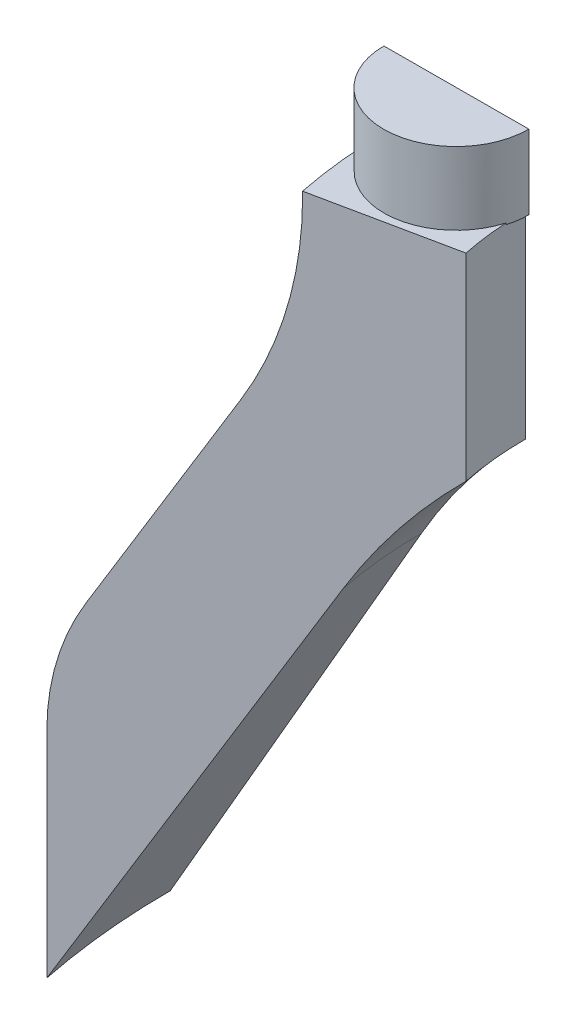
ISO-10303-21;
HEADER;
FILE_DESCRIPTION(('STEP AP214'),'2;1');
FILE_NAME('part.step','',(''),(''),'','','');
FILE_SCHEMA(('AUTOMOTIVE_DESIGN { 1 0 10303 214 1 1 1 1 }'));
ENDSEC;
DATA;
#1=APPLICATION_CONTEXT('core data for automotive mechanical design processes');
#2=APPLICATION_PROTOCOL_DEFINITION('international standard','automotive_design',2000,#1);
#3=PRODUCT_CONTEXT('',#1,'mechanical');
#4=PRODUCT('Part','Part','',(#3));
#5=PRODUCT_RELATED_PRODUCT_CATEGORY('part','',(#4));
#6=PRODUCT_DEFINITION_FORMATION('','',#4);
#7=PRODUCT_DEFINITION_CONTEXT('part definition',#1,'design');
#8=PRODUCT_DEFINITION('design','',#6,#7);
#9=PRODUCT_DEFINITION_SHAPE('','',#8);
#10=(LENGTH_UNIT() NAMED_UNIT(*) SI_UNIT(.MILLI.,.METRE.));
#11=(NAMED_UNIT(*) PLANE_ANGLE_UNIT() SI_UNIT($,.RADIAN.));
#12=(NAMED_UNIT(*) SI_UNIT($,.STERADIAN.) SOLID_ANGLE_UNIT());
#13=UNCERTAINTY_MEASURE_WITH_UNIT(LENGTH_MEASURE(1.E-05),#10,'distance_accuracy_value','');
#14=(GEOMETRIC_REPRESENTATION_CONTEXT(3) GLOBAL_UNCERTAINTY_ASSIGNED_CONTEXT((#13)) GLOBAL_UNIT_ASSIGNED_CONTEXT((#10,
#11,#12)) REPRESENTATION_CONTEXT('',''));
#15=CARTESIAN_POINT('',(0.,0.,0.));
#16=DIRECTION('',(0.,0.,1.));
#17=DIRECTION('',(1.,0.,0.));
#18=AXIS2_PLACEMENT_3D('',#15,#16,#17);
#19=CARTESIAN_POINT('',(-15.1192764526185,4.16703048843533,0.));
#20=DIRECTION('',(0.,0.,1.));
#21=DIRECTION('',(1.,0.,0.));
#22=AXIS2_PLACEMENT_3D('',#19,#20,#21);
#23=PLANE('',#22);
#24=CARTESIAN_POINT('',(-29.7610646475562,18.1196214310934,0.));
#25=DIRECTION('',(0.,0.,1.));
#26=DIRECTION('',(1.,0.,0.));
#27=AXIS2_PLACEMENT_3D('',#24,#25,#26);
#28=CIRCLE('',#27,13.5);
#29=CARTESIAN_POINT('',(-18.0689774595085,11.3709106514637,0.));
#30=VERTEX_POINT('',#29);
#31=CARTESIAN_POINT('',(-16.2610646475562,18.1196214310934,0.));
#32=VERTEX_POINT('',#31);
#33=EDGE_CURVE('E35',#30,#32,#28,.T.);
#34=ORIENTED_EDGE('',*,*,#33,.T.);
#35=DIRECTION('',(0.,1.,0.));
#36=VECTOR('',#35,1.);
#37=CARTESIAN_POINT('',(-16.2610646475562,0.,0.));
#38=LINE('',#37,#36);
#39=CARTESIAN_POINT('',(-16.2610646475562,18.2475811803875,0.));
#40=VERTEX_POINT('',#39);
#41=EDGE_CURVE('E226',#32,#40,#38,.T.);
#42=ORIENTED_EDGE('',*,*,#41,.T.);
#43=DIRECTION('',(-0.999994049509312,-0.00344977477050115,0.));
#44=VECTOR('',#43,1.);
#45=CARTESIAN_POINT('',(-13.8630610758754,18.2558538018348,0.));
#46=LINE('',#45,#44);
#47=CARTESIAN_POINT('',(-16.3630461996486,18.2472293649085,0.));
#48=VERTEX_POINT('',#47);
#49=EDGE_CURVE('E11',#40,#48,#46,.T.);
#50=ORIENTED_EDGE('',*,*,#49,.T.);
#51=DIRECTION('',(-0.00344977477050115,0.999994049509312,0.));
#52=VECTOR('',#51,1.);
#53=CARTESIAN_POINT('',(-16.3630461996486,18.2472293649085,0.));
#54=LINE('',#53,#52);
#55=CARTESIAN_POINT('',(-16.3718431253134,20.7972141911573,0.));
#56=VERTEX_POINT('',#55);
#57=EDGE_CURVE('E48',#56,#48,#54,.F.);
#58=ORIENTED_EDGE('',*,*,#57,.F.);
#59=DIRECTION('',(-0.999994049509312,-0.00344977477050115,0.));
#60=VECTOR('',#59,1.);
#61=CARTESIAN_POINT('',(-13.8718580015401,20.8058386280835,0.));
#62=LINE('',#61,#60);
#63=CARTESIAN_POINT('',(-11.3718728777669,20.8144630650098,0.));
#64=VERTEX_POINT('',#63);
#65=EDGE_CURVE('E131',#64,#56,#62,.T.);
#66=ORIENTED_EDGE('',*,*,#65,.F.);
#67=DIRECTION('',(-0.00344977477050115,0.999994049509312,0.));
#68=VECTOR('',#67,1.);
#69=CARTESIAN_POINT('',(-11.3630759521021,18.264478238761,0.));
#70=LINE('',#69,#68);
#71=CARTESIAN_POINT('',(-11.3630759521021,18.264478238761,0.));
#72=VERTEX_POINT('',#71);
#73=EDGE_CURVE('E238',#72,#64,#70,.T.);
#74=ORIENTED_EDGE('',*,*,#73,.F.);
#75=DIRECTION('',(-0.999994049509312,-0.00344977477050115,0.));
#76=VECTOR('',#75,1.);
#77=CARTESIAN_POINT('',(-13.8630610758754,18.2558538018348,0.));
#78=LINE('',#77,#76);
#79=CARTESIAN_POINT('',(-11.4837985306289,18.2640617705772,0.));
#80=VERTEX_POINT('',#79);
#81=EDGE_CURVE('E40',#72,#80,#78,.T.);
#82=ORIENTED_EDGE('',*,*,#81,.T.);
#83=DIRECTION('',(0.,1.,0.));
#84=VECTOR('',#83,1.);
#85=CARTESIAN_POINT('',(-11.4837985306289,0.,0.));
#86=LINE('',#85,#84);
#87=CARTESIAN_POINT('',(-11.4837985306289,11.5037526074365,0.));
#88=VERTEX_POINT('',#87);
#89=EDGE_CURVE('E235',#80,#88,#86,.F.);
#90=ORIENTED_EDGE('',*,*,#89,.T.);
#91=CARTESIAN_POINT('',(3.21963126821364,-3.66090111635775,0.));
#92=DIRECTION('',(0.,0.,1.));
#93=DIRECTION('',(1.,0.,0.));
#94=AXIS2_PLACEMENT_3D('',#91,#92,#93);
#95=CIRCLE('',#94,21.1224423401291);
#96=CARTESIAN_POINT('',(-15.0741048403272,6.89830290682254,0.));
#97=VERTEX_POINT('',#96);
#98=EDGE_CURVE('E242',#88,#97,#95,.T.);
#99=ORIENTED_EDGE('',*,*,#98,.T.);
#100=DIRECTION('',(-0.499904502194787,-0.866080532447983,0.));
#101=VECTOR('',#100,1.);
#102=CARTESIAN_POINT('',(0.,33.0140683959685,0.));
#103=LINE('',#102,#101);
#104=CARTESIAN_POINT('',(-23.7399897013474,-8.11527296939711,0.));
#105=VERTEX_POINT('',#104);
#106=EDGE_CURVE('E245',#97,#105,#103,.T.);
#107=ORIENTED_EDGE('',*,*,#106,.T.);
#108=DIRECTION('',(0.,1.,0.));
#109=VECTOR('',#108,1.);
#110=CARTESIAN_POINT('',(-23.7399897013474,0.,0.));
#111=LINE('',#110,#109);
#112=CARTESIAN_POINT('',(-23.7399897013474,-0.731138339016555,0.));
#113=VERTEX_POINT('',#112);
#114=EDGE_CURVE('E248',#105,#113,#111,.T.);
#115=ORIENTED_EDGE('',*,*,#114,.T.);
#116=CARTESIAN_POINT('',(-15.2399897013474,-0.731138339016555,0.));
#117=DIRECTION('',(0.,0.,1.));
#118=DIRECTION('',(1.,0.,0.));
#119=AXIS2_PLACEMENT_3D('',#116,#117,#118);
#120=CIRCLE('',#119,8.5);
#121=CARTESIAN_POINT('',(-22.6016742271552,3.51804992963916,0.));
#122=VERTEX_POINT('',#121);
#123=EDGE_CURVE('E251',#113,#122,#120,.F.);
#124=ORIENTED_EDGE('',*,*,#123,.T.);
#125=DIRECTION('',(-0.499904502194789,-0.866080532447982,0.));
#126=VECTOR('',#125,1.);
#127=CARTESIAN_POINT('',(0.,42.6752688843167,0.));
#128=LINE('',#127,#126);
#129=EDGE_CURVE('E228',#122,#30,#128,.F.);
#130=ORIENTED_EDGE('',*,*,#129,.T.);
#131=EDGE_LOOP('',(#34,#42,#50,#58,#66,#74,#82,#90,#99,#107,#115,#124,#130));
#132=FACE_BOUND('',#131,.T.);
#133=ADVANCED_FACE('F32',(#132),#23,.F.);
#134=CARTESIAN_POINT('',(0.,18.1196214310934,0.));
#135=DIRECTION('',(0.,1.,0.));
#136=DIRECTION('',(-1.,0.,0.));
#137=AXIS2_PLACEMENT_3D('',#134,#135,#136);
#138=TOROIDAL_SURFACE('',#137,29.7610646475562,13.5);
#139=ORIENTED_EDGE('',*,*,#33,.F.);
#140=CARTESIAN_POINT('',(0.,11.3709106514637,0.));
#141=DIRECTION('',(0.,1.,0.));
#142=DIRECTION('',(-1.,0.,0.));
#143=AXIS2_PLACEMENT_3D('',#140,#141,#142);
#144=CIRCLE('',#143,18.0689774595085);
#145=CARTESIAN_POINT('',(-17.7062373998093,11.3709106514637,3.60237471313311));
#146=VERTEX_POINT('',#145);
#147=EDGE_CURVE('E147',#30,#146,#144,.T.);
#148=ORIENTED_EDGE('',*,*,#147,.T.);
#149=CARTESIAN_POINT('',(-29.163602483958,18.1196214310934,5.93340198483997));
#150=DIRECTION('',(-0.199367934417198,0.,-0.97992470462083));
#151=DIRECTION('',(0.97992470462083,0.,-0.199367934417198));
#152=AXIS2_PLACEMENT_3D('',#149,#150,#151);
#153=CIRCLE('',#152,13.5);
#154=CARTESIAN_POINT('',(-15.9346189715768,18.1196214310934,3.2419348702078));
#155=VERTEX_POINT('',#154);
#156=EDGE_CURVE('E232',#155,#146,#153,.T.);
#157=ORIENTED_EDGE('',*,*,#156,.F.);
#158=CARTESIAN_POINT('',(0.,18.1196214310934,0.));
#159=DIRECTION('',(0.,1.,0.));
#160=DIRECTION('',(-1.,0.,0.));
#161=AXIS2_PLACEMENT_3D('',#158,#159,#160);
#162=CIRCLE('',#161,16.2610646475562);
#163=EDGE_CURVE('E145',#32,#155,#162,.T.);
#164=ORIENTED_EDGE('',*,*,#163,.F.);
#165=EDGE_LOOP('',(#139,#148,#157,#164));
#166=FACE_BOUND('',#165,.T.);
#167=ADVANCED_FACE('F213',(#166),#138,.F.);
#168=CARTESIAN_POINT('',(0.,11.3709106514637,0.));
#169=DIRECTION('',(0.,-1.,0.));
#170=DIRECTION('',(1.,0.,0.));
#171=AXIS2_PLACEMENT_3D('',#168,#169,#170);
#172=CONICAL_SURFACE('',#171,18.0689774595085,0.523488507740985);
#173=ORIENTED_EDGE('',*,*,#129,.F.);
#174=CARTESIAN_POINT('',(0.,3.51804992963915,0.));
#175=DIRECTION('',(0.,1.,0.));
#176=DIRECTION('',(-1.,0.,0.));
#177=AXIS2_PLACEMENT_3D('',#174,#175,#176);
#178=CIRCLE('',#177,22.6016742271552);
#179=CARTESIAN_POINT('',(-22.1479389409813,3.51804992963916,4.50604910503834));
#180=VERTEX_POINT('',#179);
#181=EDGE_CURVE('E255',#122,#180,#178,.T.);
#182=ORIENTED_EDGE('',*,*,#181,.T.);
#183=DIRECTION('',(-0.489868771651852,-0.866080532447982,0.0996649280084325));
#184=VECTOR('',#183,1.);
#185=CARTESIAN_POINT('',(-17.7062373998093,11.3709106514637,3.60237471313311));
#186=LINE('',#185,#184);
#187=EDGE_CURVE('E289',#146,#180,#186,.T.);
#188=ORIENTED_EDGE('',*,*,#187,.F.);
#189=ORIENTED_EDGE('',*,*,#147,.F.);
#190=EDGE_LOOP('',(#173,#182,#188,#189));
#191=FACE_BOUND('',#190,.T.);
#192=ADVANCED_FACE('F210',(#191),#172,.T.);
#193=CARTESIAN_POINT('',(0.,-0.731138339016561,0.));
#194=DIRECTION('',(0.,1.,0.));
#195=DIRECTION('',(-1.,0.,0.));
#196=AXIS2_PLACEMENT_3D('',#193,#194,#195);
#197=TOROIDAL_SURFACE('',#196,15.2399897013474,8.5);
#198=ORIENTED_EDGE('',*,*,#123,.F.);
#199=CARTESIAN_POINT('',(0.,-0.731138339016562,0.));
#200=DIRECTION('',(0.,1.,0.));
#201=DIRECTION('',(-1.,0.,0.));
#202=AXIS2_PLACEMENT_3D('',#199,#200,#201);
#203=CIRCLE('',#202,23.7399897013474);
#204=CARTESIAN_POINT('',(-23.2634023957943,-0.731138339016555,4.73299270984317));
#205=VERTEX_POINT('',#204);
#206=EDGE_CURVE('E260',#113,#205,#203,.T.);
#207=ORIENTED_EDGE('',*,*,#206,.T.);
#208=CARTESIAN_POINT('',(-14.9340424065173,-0.731138339016555,3.03836526729699));
#209=DIRECTION('',(0.199367934417198,0.,0.97992470462083));
#210=DIRECTION('',(0.97992470462083,0.,-0.199367934417198));
#211=AXIS2_PLACEMENT_3D('',#208,#209,#210);
#212=CIRCLE('',#211,8.5);
#213=EDGE_CURVE('E257',#180,#205,#212,.T.);
#214=ORIENTED_EDGE('',*,*,#213,.F.);
#215=ORIENTED_EDGE('',*,*,#181,.F.);
#216=EDGE_LOOP('',(#198,#207,#214,#215));
#217=FACE_BOUND('',#216,.T.);
#218=ADVANCED_FACE('F206',(#217),#197,.T.);
#219=CARTESIAN_POINT('',(0.,0.,0.));
#220=DIRECTION('',(0.,1.,0.));
#221=DIRECTION('',(-1.,0.,0.));
#222=AXIS2_PLACEMENT_3D('',#219,#220,#221);
#223=CYLINDRICAL_SURFACE('',#222,23.7399897013474);
#224=ORIENTED_EDGE('',*,*,#114,.F.);
#225=CARTESIAN_POINT('',(0.,-8.11527296939712,0.));
#226=DIRECTION('',(0.,1.,0.));
#227=DIRECTION('',(-1.,0.,0.));
#228=AXIS2_PLACEMENT_3D('',#225,#226,#227);
#229=CIRCLE('',#228,23.7399897013474);
#230=CARTESIAN_POINT('',(-23.2634023957944,-8.11527296939711,4.73299270984317));
#231=VERTEX_POINT('',#230);
#232=EDGE_CURVE('E262',#105,#231,#229,.T.);
#233=ORIENTED_EDGE('',*,*,#232,.T.);
#234=DIRECTION('',(0.,-1.,0.));
#235=VECTOR('',#234,1.);
#236=CARTESIAN_POINT('',(-23.2634023957944,-0.731138339016557,4.73299270984317));
#237=LINE('',#236,#235);
#238=EDGE_CURVE('E285',#205,#231,#237,.T.);
#239=ORIENTED_EDGE('',*,*,#238,.F.);
#240=ORIENTED_EDGE('',*,*,#206,.F.);
#241=EDGE_LOOP('',(#224,#233,#239,#240));
#242=FACE_BOUND('',#241,.T.);
#243=ADVANCED_FACE('F202',(#242),#223,.T.);
#244=CARTESIAN_POINT('',(0.,-8.11527296939712,0.));
#245=DIRECTION('',(0.,-1.,0.));
#246=DIRECTION('',(1.,0.,0.));
#247=AXIS2_PLACEMENT_3D('',#244,#245,#246);
#248=CONICAL_SURFACE('',#247,23.7399897013474,0.523488507740983);
#249=ORIENTED_EDGE('',*,*,#106,.F.);
#250=CARTESIAN_POINT('',(0.,6.89830290682253,0.));
#251=DIRECTION('',(0.,1.,0.));
#252=DIRECTION('',(-1.,0.,0.));
#253=AXIS2_PLACEMENT_3D('',#250,#251,#252);
#254=CIRCLE('',#253,15.0741048403272);
#255=CARTESIAN_POINT('',(-14.7714877330811,6.89830290682254,3.00529314520432));
#256=VERTEX_POINT('',#255);
#257=EDGE_CURVE('E266',#97,#256,#254,.T.);
#258=ORIENTED_EDGE('',*,*,#257,.T.);
#259=DIRECTION('',(0.48986877165185,0.866080532447983,-0.0996649280084321));
#260=VECTOR('',#259,1.);
#261=CARTESIAN_POINT('',(-23.2634023957944,-8.11527296939711,4.73299270984317));
#262=LINE('',#261,#260);
#263=EDGE_CURVE('E282',#231,#256,#262,.T.);
#264=ORIENTED_EDGE('',*,*,#263,.F.);
#265=ORIENTED_EDGE('',*,*,#232,.F.);
#266=EDGE_LOOP('',(#249,#258,#264,#265));
#267=FACE_BOUND('',#266,.T.);
#268=ADVANCED_FACE('F199',(#267),#248,.F.);
#269=CARTESIAN_POINT('',(-29.163602483958,18.1196214310934,5.93340198483997));
#270=DIRECTION('',(0.199367934417198,0.,0.97992470462083));
#271=DIRECTION('',(0.97992470462083,0.,-0.199367934417198));
#272=AXIS2_PLACEMENT_3D('',#269,#270,#271);
#273=PLANE('',#272);
#274=ORIENTED_EDGE('',*,*,#156,.T.);
#275=ORIENTED_EDGE('',*,*,#187,.T.);
#276=ORIENTED_EDGE('',*,*,#213,.T.);
#277=ORIENTED_EDGE('',*,*,#238,.T.);
#278=ORIENTED_EDGE('',*,*,#263,.T.);
#279=CARTESIAN_POINT('',(3.15499621949224,-3.66090111635775,-0.641891235528777));
#280=DIRECTION('',(-0.199367934417198,0.,-0.97992470462083));
#281=DIRECTION('',(0.97992470462083,0.,-0.199367934417198));
#282=AXIS2_PLACEMENT_3D('',#279,#280,#281);
#283=CIRCLE('',#282,21.1224423401291);
#284=CARTESIAN_POINT('',(-11.2532578830517,11.5037526074365,2.28950119231474));
#285=VERTEX_POINT('',#284);
#286=EDGE_CURVE('E279',#256,#285,#283,.T.);
#287=ORIENTED_EDGE('',*,*,#286,.T.);
#288=DIRECTION('',(0.,1.,0.));
#289=VECTOR('',#288,1.);
#290=CARTESIAN_POINT('',(-11.2532578830517,11.5037526074365,2.28950119231474));
#291=LINE('',#290,#289);
#292=CARTESIAN_POINT('',(-11.2532578830517,18.3170798925325,2.28950119231474));
#293=VERTEX_POINT('',#292);
#294=EDGE_CURVE('E276',#285,#293,#291,.T.);
#295=ORIENTED_EDGE('',*,*,#294,.T.);
#296=DIRECTION('',(-0.979919727516482,-0.00318717907963364,0.199366921813874));
#297=VECTOR('',#296,1.);
#298=CARTESIAN_POINT('',(-11.2532578830517,18.3170798925325,2.28950119231474));
#299=LINE('',#298,#297);
#300=CARTESIAN_POINT('',(-15.9346189715768,18.3018538125724,3.2419348702078));
#301=VERTEX_POINT('',#300);
#302=EDGE_CURVE('E273',#293,#301,#299,.T.);
#303=ORIENTED_EDGE('',*,*,#302,.T.);
#304=DIRECTION('',(0.,-1.,0.));
#305=VECTOR('',#304,1.);
#306=CARTESIAN_POINT('',(-15.9346189715768,18.3018538125724,3.2419348702078));
#307=LINE('',#306,#305);
#308=EDGE_CURVE('E234',#301,#155,#307,.T.);
#309=ORIENTED_EDGE('',*,*,#308,.T.);
#310=EDGE_LOOP('',(#274,#275,#276,#277,#278,#287,#295,#303,#309));
#311=FACE_BOUND('',#310,.T.);
#312=ADVANCED_FACE('F167',(#311),#273,.T.);
#313=CARTESIAN_POINT('',(0.,18.3170798925324,0.));
#314=DIRECTION('',(0.,-1.,0.));
#315=DIRECTION('',(1.,0.,0.));
#316=AXIS2_PLACEMENT_3D('',#313,#314,#315);
#317=CONICAL_SURFACE('',#316,11.4837985306289,1.56760914231928);
#318=CARTESIAN_POINT('',(-11.4105498393097,18.3172806538364,0.483963593978391));
#319=CARTESIAN_POINT('',(-11.4241550189144,18.3172280344181,0.552949417201796));
#320=CARTESIAN_POINT('',(-11.4406831249092,18.3171641880578,0.621355233227294));
#321=CARTESIAN_POINT('',(-11.4794379043555,18.3170150272682,0.756529694868394));
#322=CARTESIAN_POINT('',(-11.5016643049387,18.3169297138669,0.823298418710074));
#323=CARTESIAN_POINT('',(-11.5516521885245,18.3167386665825,0.954682160759538));
#324=CARTESIAN_POINT('',(-11.5794097797089,18.3166329470591,1.01929865620213));
#325=CARTESIAN_POINT('',(-11.6402537748046,18.3164023848177,1.14594961093553));
#326=CARTESIAN_POINT('',(-11.6733401139658,18.316277542332,1.20798410158909));
#327=CARTESIAN_POINT('',(-11.7803033906154,18.3158762585749,1.38960778391637));
#328=CARTESIAN_POINT('',(-11.8619058079241,18.3155729789965,1.5047728124125));
#329=CARTESIAN_POINT('',(-12.0432289188816,18.3149087088195,1.71968023258093));
#330=CARTESIAN_POINT('',(-12.142946020132,18.3145477296654,1.81942567492879));
#331=CARTESIAN_POINT('',(-12.3577226096007,18.3137823207993,2.00078085168342));
#332=CARTESIAN_POINT('',(-12.4727824099553,18.3133778902034,2.08239021703448));
#333=CARTESIAN_POINT('',(-12.7149852624169,18.3125402974258,2.22514188951392));
#334=CARTESIAN_POINT('',(-12.8421302139353,18.3121071307309,2.28628097249593));
#335=CARTESIAN_POINT('',(-13.1048760732057,18.3112264428274,2.38634292100166));
#336=CARTESIAN_POINT('',(-13.2404766548838,18.3107789221726,2.42526664262763));
#337=CARTESIAN_POINT('',(-13.5162766551708,18.309882963976,2.47979262163742));
#338=CARTESIAN_POINT('',(-13.656475702217,18.309434526511,2.49539675855723));
#339=CARTESIAN_POINT('',(-13.9375044946487,18.3085489392445,2.5028471014302));
#340=CARTESIAN_POINT('',(-14.0783342434557,18.3081117895043,2.4946931783434));
#341=CARTESIAN_POINT('',(-14.3566358962057,18.307259696719,2.45485704074626));
#342=CARTESIAN_POINT('',(-14.4941075653736,18.3068447552241,2.42317318601114));
#343=CARTESIAN_POINT('',(-14.7617822669225,18.3060467144064,2.33717412610578));
#344=CARTESIAN_POINT('',(-14.8919851843592,18.3056636155872,2.28285856316391));
#345=CARTESIAN_POINT('',(-15.1414110739353,18.3049375831191,2.15314456225611));
#346=CARTESIAN_POINT('',(-15.2606351530492,18.30459464542,2.07774825292074));
#347=CARTESIAN_POINT('',(-15.4847399121016,18.3039558559943,1.9080060784989));
#348=CARTESIAN_POINT('',(-15.5896197855035,18.3036600069151,1.81365914860489));
#349=CARTESIAN_POINT('',(-15.7820519433848,18.3031211460252,1.60869642533349));
#350=CARTESIAN_POINT('',(-15.8696044203602,18.3028781336274,1.49808081271432));
#351=CARTESIAN_POINT('',(-16.0160733689074,18.3024738262112,1.27703106877934));
#352=CARTESIAN_POINT('',(-16.0771126243122,18.3023063853919,1.16800265591048));
#353=CARTESIAN_POINT('',(-16.1559564521542,18.3020908665784,0.998655660830306));
#354=CARTESIAN_POINT('',(-16.1801221723123,18.3020249576013,0.941226998274327));
#355=CARTESIAN_POINT('',(-16.2241050986042,18.3019051908431,0.824720190427642));
#356=CARTESIAN_POINT('',(-16.2439217936865,18.3018513344784,0.765641852202934));
#357=CARTESIAN_POINT('',(-16.261509546991,18.3018035876728,0.705885082353683));
#358=B_SPLINE_CURVE_WITH_KNOTS('',3,(#318,#319,#320,#321,#322,#323,#324,#325,#326,#327,#328,
#329,#330,#331,#332,#333,#334,#335,#336,#337,#338,#339,#340,#341,#342,#343,#344,#345,#346,#347,
#348,#349,#350,#351,#352,#353,#354,#355,#356,#357),.UNSPECIFIED.,.F.,.F.,(4,2,2,2,2,2,2,2,2,2,2,
2,2,2,2,2,2,2,2,4),(0.,0.210875294626943,0.421740493168286,0.632457844767325,0.843172636106629,
1.2644258585558,1.6855956315449,2.10677397424182,2.52801862293774,2.94924703724358,
3.37044149911498,3.79163824867373,4.21286436177706,4.63409713405385,5.05528738765902,
5.47650131394946,5.89771056056604,6.27108994496157,6.45785560695896,6.64464320395044),.UNSPECIFIED.);
#359=CARTESIAN_POINT('',(-11.462585169569,18.3170798925325,0.697688986873041));
#360=VERTEX_POINT('',#359);
#361=CARTESIAN_POINT('',(-16.2430166278677,18.3018538125724,0.765920556466206));
#362=VERTEX_POINT('',#361);
#363=EDGE_CURVE('E149',#360,#362,#358,.T.);
#364=ORIENTED_EDGE('',*,*,#363,.T.);
#365=CARTESIAN_POINT('',(0.,18.3018538125724,0.));
#366=DIRECTION('',(0.,1.,0.));
#367=DIRECTION('',(-1.,0.,0.));
#368=AXIS2_PLACEMENT_3D('',#365,#366,#367);
#369=CIRCLE('',#368,16.2610646475562);
#370=EDGE_CURVE('E144',#362,#301,#369,.T.);
#371=ORIENTED_EDGE('',*,*,#370,.T.);
#372=ORIENTED_EDGE('',*,*,#302,.F.);
#373=CARTESIAN_POINT('',(0.,18.3170798925324,0.));
#374=DIRECTION('',(0.,1.,0.));
#375=DIRECTION('',(-1.,0.,0.));
#376=AXIS2_PLACEMENT_3D('',#373,#374,#375);
#377=CIRCLE('',#376,11.4837985306289);
#378=EDGE_CURVE('E184',#360,#293,#377,.T.);
#379=ORIENTED_EDGE('',*,*,#378,.F.);
#380=EDGE_LOOP('',(#364,#371,#372,#379));
#381=FACE_BOUND('',#380,.T.);
#382=ADVANCED_FACE('F186',(#381),#317,.T.);
#383=CARTESIAN_POINT('',(0.,0.,0.));
#384=DIRECTION('',(0.,1.,0.));
#385=DIRECTION('',(-1.,0.,0.));
#386=AXIS2_PLACEMENT_3D('',#383,#384,#385);
#387=CYLINDRICAL_SURFACE('',#386,11.4837985306289);
#388=ORIENTED_EDGE('',*,*,#89,.F.);
#389=CARTESIAN_POINT('',(0.,18.3036785247568,0.));
#390=DIRECTION('',(0.00344977477050115,-0.999994049509312,0.));
#391=DIRECTION('',(0.999994049509312,0.00344977477050115,0.));
#392=AXIS2_PLACEMENT_3D('',#389,#390,#391);
#393=ELLIPSE('',#392,11.4838668652718,11.4837985306289);
#394=CARTESIAN_POINT('',(-11.4625535415784,18.2641350614406,0.698208420547165));
#395=VERTEX_POINT('',#394);
#396=EDGE_CURVE('E139',#395,#80,#393,.T.);
#397=ORIENTED_EDGE('',*,*,#396,.F.);
#398=CARTESIAN_POINT('',(-11.4625535415784,18.2641350614406,0.698208420547138));
#399=CARTESIAN_POINT('',(-11.4625588127797,18.2729592002943,0.698121882751777));
#400=CARTESIAN_POINT('',(-11.4625640840463,18.2817833389788,0.698035327714554));
#401=CARTESIAN_POINT('',(-11.4625746267106,18.2994316160094,0.697862183156387));
#402=CARTESIAN_POINT('',(-11.4625798981081,18.3082557543555,0.697775593635442));
#403=CARTESIAN_POINT('',(-11.4625851695711,18.3170798925325,0.697688986872636));
#404=B_SPLINE_CURVE_WITH_KNOTS('',3,(#398,#399,#400,#401,#402,#403),.UNSPECIFIED.,.F.,.F.,(4,2,
4),(0.,0.0264736942597388,0.0529473885194714),.UNSPECIFIED.);
#405=EDGE_CURVE('E171',#395,#360,#404,.T.);
#406=ORIENTED_EDGE('',*,*,#405,.T.);
#407=ORIENTED_EDGE('',*,*,#378,.T.);
#408=ORIENTED_EDGE('',*,*,#294,.F.);
#409=CARTESIAN_POINT('',(0.,11.5037526074365,0.));
#410=DIRECTION('',(0.,1.,0.));
#411=DIRECTION('',(-1.,0.,0.));
#412=AXIS2_PLACEMENT_3D('',#409,#410,#411);
#413=CIRCLE('',#412,11.4837985306289);
#414=EDGE_CURVE('E268',#88,#285,#413,.T.);
#415=ORIENTED_EDGE('',*,*,#414,.F.);
#416=EDGE_LOOP('',(#388,#397,#406,#407,#408,#415));
#417=FACE_BOUND('',#416,.T.);
#418=ADVANCED_FACE('F166',(#417),#387,.F.);
#419=CARTESIAN_POINT('',(-13.8630610758754,18.2558538018348,0.));
#420=DIRECTION('',(-0.00344977477050115,0.999994049509312,0.));
#421=DIRECTION('',(-0.999994049509312,-0.00344977477050115,0.));
#422=AXIS2_PLACEMENT_3D('',#419,#420,#421);
#423=CYLINDRICAL_SURFACE('',#422,2.5);
#424=CARTESIAN_POINT('',(-13.8630610758754,18.2558538018348,0.));
#425=DIRECTION('',(0.00344977477050115,-0.999994049509312,0.));
#426=DIRECTION('',(0.999994049509312,0.00344977477050115,0.));
#427=AXIS2_PLACEMENT_3D('',#424,#425,#426);
#428=CIRCLE('',#427,2.5);
#429=EDGE_CURVE('E141',#72,#395,#428,.T.);
#430=ORIENTED_EDGE('',*,*,#429,.F.);
#431=ORIENTED_EDGE('',*,*,#73,.T.);
#432=CARTESIAN_POINT('',(-13.8718580015401,20.8058386280835,0.));
#433=DIRECTION('',(0.00344977477050115,-0.999994049509312,0.));
#434=DIRECTION('',(0.999994049509312,0.00344977477050115,0.));
#435=AXIS2_PLACEMENT_3D('',#432,#433,#434);
#436=CIRCLE('',#435,2.5);
#437=EDGE_CURVE('E272',#64,#56,#436,.T.);
#438=ORIENTED_EDGE('',*,*,#437,.T.);
#439=ORIENTED_EDGE('',*,*,#57,.T.);
#440=CARTESIAN_POINT('',(-16.2430487326133,18.2476433316061,0.765239401725931));
#441=VERTEX_POINT('',#440);
#442=EDGE_CURVE('E128',#441,#48,#428,.T.);
#443=ORIENTED_EDGE('',*,*,#442,.F.);
#444=CARTESIAN_POINT('',(-16.2430166278677,18.3018538125724,0.765920556466206));
#445=CARTESIAN_POINT('',(-16.2430219783766,18.2928187317001,0.765807087274636));
#446=CARTESIAN_POINT('',(-16.2430273290265,18.2837836511833,0.765693589783836));
#447=CARTESIAN_POINT('',(-16.2430380306084,18.2657134908613,0.765466538203771));
#448=CARTESIAN_POINT('',(-16.2430433815403,18.2566784110559,0.765352984114507));
#449=CARTESIAN_POINT('',(-16.2430487326133,18.2476433316061,0.765239401726011));
#450=B_SPLINE_CURVE_WITH_KNOTS('',3,(#444,#445,#446,#447,#448,#449),.UNSPECIFIED.,.F.,.F.,(4,2,
4),(0.,0.0271073848292364,0.0542147696584726),.UNSPECIFIED.);
#451=EDGE_CURVE('E137',#362,#441,#450,.T.);
#452=ORIENTED_EDGE('',*,*,#451,.F.);
#453=ORIENTED_EDGE('',*,*,#363,.F.);
#454=ORIENTED_EDGE('',*,*,#405,.F.);
#455=EDGE_LOOP('',(#430,#431,#438,#439,#443,#452,#453,#454));
#456=FACE_BOUND('',#455,.T.);
#457=ADVANCED_FACE('F135',(#456),#423,.T.);
#458=CARTESIAN_POINT('',(-13.8718580015401,20.8058386280835,0.));
#459=DIRECTION('',(0.00344977477050115,-0.999994049509312,0.));
#460=DIRECTION('',(0.999994049509312,0.00344977477050115,0.));
#461=AXIS2_PLACEMENT_3D('',#458,#459,#460);
#462=PLANE('',#461);
#463=ORIENTED_EDGE('',*,*,#437,.F.);
#464=ORIENTED_EDGE('',*,*,#65,.T.);
#465=EDGE_LOOP('',(#463,#464));
#466=FACE_BOUND('',#465,.T.);
#467=ADVANCED_FACE('F165',(#466),#462,.F.);
#468=CARTESIAN_POINT('',(0.,0.,0.));
#469=DIRECTION('',(0.,1.,0.));
#470=DIRECTION('',(-1.,0.,0.));
#471=AXIS2_PLACEMENT_3D('',#468,#469,#470);
#472=CYLINDRICAL_SURFACE('',#471,16.2610646475562);
#473=ORIENTED_EDGE('',*,*,#41,.F.);
#474=ORIENTED_EDGE('',*,*,#163,.T.);
#475=ORIENTED_EDGE('',*,*,#308,.F.);
#476=ORIENTED_EDGE('',*,*,#370,.F.);
#477=ORIENTED_EDGE('',*,*,#451,.T.);
#478=CARTESIAN_POINT('',(0.,18.3036785247568,0.));
#479=DIRECTION('',(0.00344977477050115,-0.999994049509312,0.));
#480=DIRECTION('',(0.999994049509312,0.00344977477050115,0.));
#481=AXIS2_PLACEMENT_3D('',#478,#479,#480);
#482=ELLIPSE('',#481,16.2611614094458,16.2610646475562);
#483=EDGE_CURVE('E126',#40,#441,#482,.F.);
#484=ORIENTED_EDGE('',*,*,#483,.F.);
#485=EDGE_LOOP('',(#473,#474,#475,#476,#477,#484));
#486=FACE_BOUND('',#485,.T.);
#487=ADVANCED_FACE('F142',(#486),#472,.T.);
#488=CARTESIAN_POINT('',(-13.8630610758754,18.2558538018348,0.));
#489=DIRECTION('',(0.00344977477050115,-0.999994049509312,0.));
#490=DIRECTION('',(0.999994049509312,0.00344977477050115,0.));
#491=AXIS2_PLACEMENT_3D('',#488,#489,#490);
#492=PLANE('',#491);
#493=ORIENTED_EDGE('',*,*,#49,.F.);
#494=ORIENTED_EDGE('',*,*,#483,.T.);
#495=ORIENTED_EDGE('',*,*,#442,.T.);
#496=EDGE_LOOP('',(#493,#494,#495));
#497=FACE_BOUND('',#496,.T.);
#498=ADVANCED_FACE('F127',(#497),#492,.T.);
#499=ORIENTED_EDGE('',*,*,#81,.F.);
#500=ORIENTED_EDGE('',*,*,#429,.T.);
#501=ORIENTED_EDGE('',*,*,#396,.T.);
#502=EDGE_LOOP('',(#499,#500,#501));
#503=FACE_BOUND('',#502,.T.);
#504=ADVANCED_FACE('F197',(#503),#492,.T.);
#505=CARTESIAN_POINT('',(0.,-3.66090111635775,0.));
#506=DIRECTION('',(0.,1.,0.));
#507=DIRECTION('',(-1.,0.,0.));
#508=AXIS2_PLACEMENT_3D('',#505,#506,#507);
#509=DEGENERATE_TOROIDAL_SURFACE('',#508,3.21963126821365,21.1224423401291,.F.);
#510=ORIENTED_EDGE('',*,*,#98,.F.);
#511=ORIENTED_EDGE('',*,*,#414,.T.);
#512=ORIENTED_EDGE('',*,*,#286,.F.);
#513=ORIENTED_EDGE('',*,*,#257,.F.);
#514=EDGE_LOOP('',(#510,#511,#512,#513));
#515=FACE_BOUND('',#514,.T.);
#516=ADVANCED_FACE('F194',(#515),#509,.T.);
#517=CLOSED_SHELL('',(#133,#167,#192,#218,#243,#268,#312,#382,#418,#457,#467,#487,#498,#504,#516));
#518=MANIFOLD_SOLID_BREP('B2',#517);
#519=ADVANCED_BREP_SHAPE_REPRESENTATION('',(#18,#518),#14);
#520=SHAPE_DEFINITION_REPRESENTATION(#9,#519);
ENDSEC;
END-ISO-10303-21;
